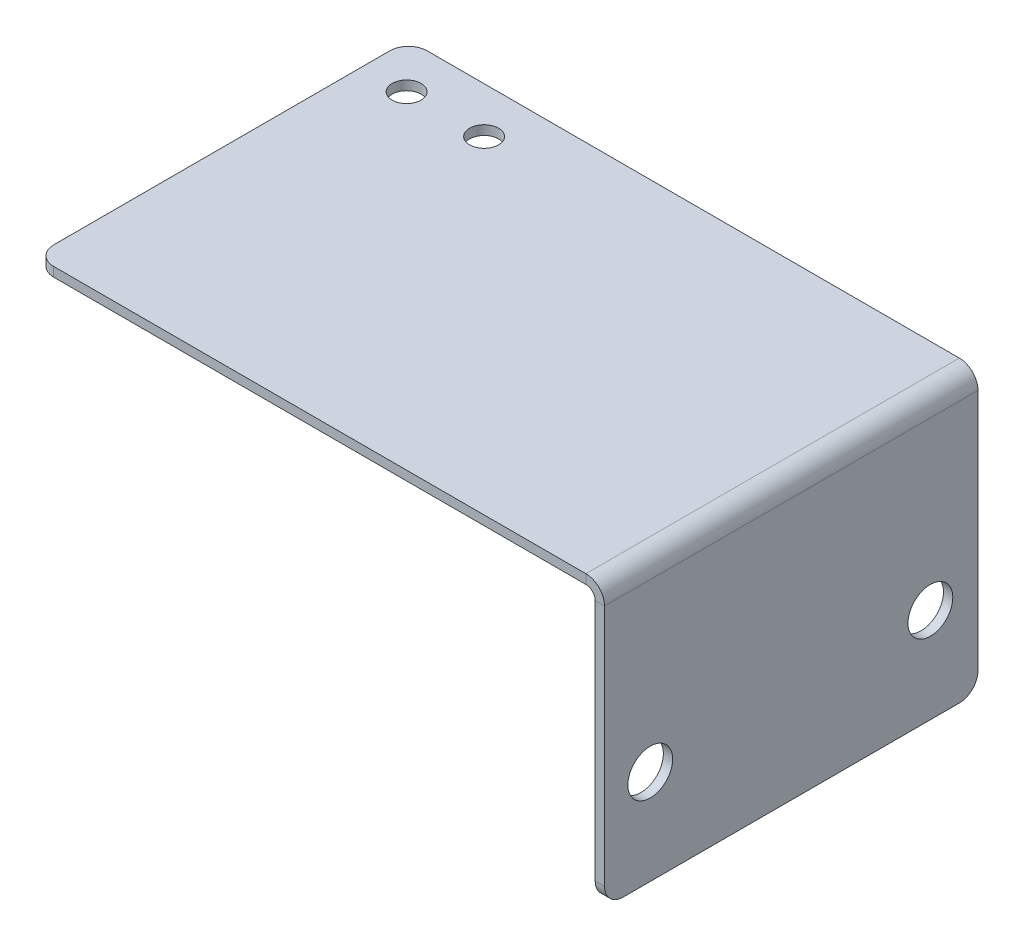
ISO-10303-21;
HEADER;
FILE_DESCRIPTION(('STEP AP214'),'2;1');
FILE_NAME('part.step','',(''),(''),'','','');
FILE_SCHEMA(('AUTOMOTIVE_DESIGN { 1 0 10303 214 1 1 1 1 }'));
ENDSEC;
DATA;
#1=APPLICATION_CONTEXT('core data for automotive mechanical design processes');
#2=APPLICATION_PROTOCOL_DEFINITION('international standard','automotive_design',2000,#1);
#3=PRODUCT_CONTEXT('',#1,'mechanical');
#4=PRODUCT('Part','Part','',(#3));
#5=PRODUCT_RELATED_PRODUCT_CATEGORY('part','',(#4));
#6=PRODUCT_DEFINITION_FORMATION('','',#4);
#7=PRODUCT_DEFINITION_CONTEXT('part definition',#1,'design');
#8=PRODUCT_DEFINITION('design','',#6,#7);
#9=PRODUCT_DEFINITION_SHAPE('','',#8);
#10=(LENGTH_UNIT() NAMED_UNIT(*) SI_UNIT(.MILLI.,.METRE.));
#11=(NAMED_UNIT(*) PLANE_ANGLE_UNIT() SI_UNIT($,.RADIAN.));
#12=(NAMED_UNIT(*) SI_UNIT($,.STERADIAN.) SOLID_ANGLE_UNIT());
#13=UNCERTAINTY_MEASURE_WITH_UNIT(LENGTH_MEASURE(1.E-05),#10,'distance_accuracy_value','');
#14=(GEOMETRIC_REPRESENTATION_CONTEXT(3) GLOBAL_UNCERTAINTY_ASSIGNED_CONTEXT((#13)) GLOBAL_UNIT_ASSIGNED_CONTEXT((#10,
#11,#12)) REPRESENTATION_CONTEXT('',''));
#15=CARTESIAN_POINT('',(0.,0.,0.));
#16=DIRECTION('',(0.,0.,1.));
#17=DIRECTION('',(1.,0.,0.));
#18=AXIS2_PLACEMENT_3D('',#15,#16,#17);
#19=CARTESIAN_POINT('',(0.,-2.,40.));
#20=DIRECTION('',(0.,0.,1.));
#21=DIRECTION('',(1.,0.,0.));
#22=AXIS2_PLACEMENT_3D('',#19,#20,#21);
#23=PLANE('',#22);
#24=DIRECTION('',(-1.,0.,0.));
#25=VECTOR('',#24,1.);
#26=CARTESIAN_POINT('',(0.,-2.,40.));
#27=LINE('',#26,#25);
#28=CARTESIAN_POINT('',(0.,-2.,40.));
#29=VERTEX_POINT('',#28);
#30=CARTESIAN_POINT('',(-1.,-2.,40.));
#31=VERTEX_POINT('',#30);
#32=EDGE_CURVE('E136',#29,#31,#27,.T.);
#33=ORIENTED_EDGE('',*,*,#32,.F.);
#34=CARTESIAN_POINT('',(-2.00000000000001,-2.,40.));
#35=DIRECTION('',(0.,0.,1.));
#36=DIRECTION('',(1.,0.,0.));
#37=AXIS2_PLACEMENT_3D('',#34,#35,#36);
#38=CIRCLE('',#37,2.);
#39=CARTESIAN_POINT('',(-2.00000000000004,0.,40.));
#40=VERTEX_POINT('',#39);
#41=EDGE_CURVE('E140',#40,#29,#38,.F.);
#42=ORIENTED_EDGE('',*,*,#41,.F.);
#43=DIRECTION('',(0.,1.,0.));
#44=VECTOR('',#43,1.);
#45=CARTESIAN_POINT('',(-2.00000000000002,-1.,40.));
#46=LINE('',#45,#44);
#47=CARTESIAN_POINT('',(-2.00000000000002,-1.,40.));
#48=VERTEX_POINT('',#47);
#49=EDGE_CURVE('E149',#48,#40,#46,.T.);
#50=ORIENTED_EDGE('',*,*,#49,.F.);
#51=CARTESIAN_POINT('',(-2.00000000000001,-2.,40.));
#52=DIRECTION('',(0.,0.,1.));
#53=DIRECTION('',(1.,0.,0.));
#54=AXIS2_PLACEMENT_3D('',#51,#52,#53);
#55=CIRCLE('',#54,1.);
#56=EDGE_CURVE('E142',#48,#31,#55,.F.);
#57=ORIENTED_EDGE('',*,*,#56,.T.);
#58=EDGE_LOOP('',(#33,#42,#50,#57));
#59=FACE_BOUND('',#58,.T.);
#60=ADVANCED_FACE('F44',(#59),#23,.T.);
#61=CARTESIAN_POINT('',(-2.00000000000002,-1.,40.));
#62=DIRECTION('',(0.,0.,1.));
#63=DIRECTION('',(1.,0.,0.));
#64=AXIS2_PLACEMENT_3D('',#61,#62,#63);
#65=PLANE('',#64);
#66=DIRECTION('',(0.,-1.,0.));
#67=VECTOR('',#66,1.);
#68=CARTESIAN_POINT('',(-1.,0.,40.));
#69=LINE('',#68,#67);
#70=CARTESIAN_POINT('',(-0.999999999999997,-28.,40.));
#71=VERTEX_POINT('',#70);
#72=EDGE_CURVE('E172',#31,#71,#69,.T.);
#73=ORIENTED_EDGE('',*,*,#72,.T.);
#74=DIRECTION('',(-1.,0.,0.));
#75=VECTOR('',#74,1.);
#76=CARTESIAN_POINT('',(-2.00000000000002,-28.,40.));
#77=LINE('',#76,#75);
#78=CARTESIAN_POINT('',(0.,-28.,40.));
#79=VERTEX_POINT('',#78);
#80=EDGE_CURVE('E170',#71,#79,#77,.F.);
#81=ORIENTED_EDGE('',*,*,#80,.T.);
#82=DIRECTION('',(0.,-1.,0.));
#83=VECTOR('',#82,1.);
#84=CARTESIAN_POINT('',(0.,0.,40.));
#85=LINE('',#84,#83);
#86=EDGE_CURVE('E157',#29,#79,#85,.T.);
#87=ORIENTED_EDGE('',*,*,#86,.F.);
#88=ORIENTED_EDGE('',*,*,#32,.T.);
#89=EDGE_LOOP('',(#73,#81,#87,#88));
#90=FACE_BOUND('',#89,.T.);
#91=ADVANCED_FACE('F168',(#90),#65,.T.);
#92=CARTESIAN_POINT('',(-2.00000000000004,0.,0.));
#93=DIRECTION('',(0.,0.,-1.));
#94=DIRECTION('',(-1.,0.,0.));
#95=AXIS2_PLACEMENT_3D('',#92,#93,#94);
#96=PLANE('',#95);
#97=DIRECTION('',(0.,-1.,0.));
#98=VECTOR('',#97,1.);
#99=CARTESIAN_POINT('',(-2.00000000000004,0.,0.));
#100=LINE('',#99,#98);
#101=CARTESIAN_POINT('',(-2.00000000000004,0.,0.));
#102=VERTEX_POINT('',#101);
#103=CARTESIAN_POINT('',(-2.00000000000002,-1.,0.));
#104=VERTEX_POINT('',#103);
#105=EDGE_CURVE('E236',#102,#104,#100,.T.);
#106=ORIENTED_EDGE('',*,*,#105,.F.);
#107=CARTESIAN_POINT('',(-2.00000000000001,-2.,0.));
#108=DIRECTION('',(0.,0.,1.));
#109=DIRECTION('',(1.,0.,0.));
#110=AXIS2_PLACEMENT_3D('',#107,#108,#109);
#111=CIRCLE('',#110,2.);
#112=CARTESIAN_POINT('',(0.,-2.,0.));
#113=VERTEX_POINT('',#112);
#114=EDGE_CURVE('E198',#102,#113,#111,.F.);
#115=ORIENTED_EDGE('',*,*,#114,.T.);
#116=DIRECTION('',(1.,0.,0.));
#117=VECTOR('',#116,1.);
#118=CARTESIAN_POINT('',(-1.,-2.,0.));
#119=LINE('',#118,#117);
#120=CARTESIAN_POINT('',(-1.,-2.,0.));
#121=VERTEX_POINT('',#120);
#122=EDGE_CURVE('E233',#121,#113,#119,.T.);
#123=ORIENTED_EDGE('',*,*,#122,.F.);
#124=CARTESIAN_POINT('',(-2.00000000000001,-2.,0.));
#125=DIRECTION('',(0.,0.,1.));
#126=DIRECTION('',(1.,0.,0.));
#127=AXIS2_PLACEMENT_3D('',#124,#125,#126);
#128=CIRCLE('',#127,1.);
#129=EDGE_CURVE('E207',#104,#121,#128,.F.);
#130=ORIENTED_EDGE('',*,*,#129,.F.);
#131=EDGE_LOOP('',(#106,#115,#123,#130));
#132=FACE_BOUND('',#131,.T.);
#133=ADVANCED_FACE('F370',(#132),#96,.T.);
#134=CARTESIAN_POINT('',(-1.,-2.,0.));
#135=DIRECTION('',(0.,0.,-1.));
#136=DIRECTION('',(-1.,0.,0.));
#137=AXIS2_PLACEMENT_3D('',#134,#135,#136);
#138=PLANE('',#137);
#139=DIRECTION('',(1.,0.,0.));
#140=VECTOR('',#139,1.);
#141=CARTESIAN_POINT('',(-61.,-1.,0.));
#142=LINE('',#141,#140);
#143=CARTESIAN_POINT('',(-59.,-1.,0.));
#144=VERTEX_POINT('',#143);
#145=EDGE_CURVE('E204',#144,#104,#142,.T.);
#146=ORIENTED_EDGE('',*,*,#145,.F.);
#147=DIRECTION('',(0.,1.,0.));
#148=VECTOR('',#147,1.);
#149=CARTESIAN_POINT('',(-59.,-2.,0.));
#150=LINE('',#149,#148);
#151=CARTESIAN_POINT('',(-59.,0.,0.));
#152=VERTEX_POINT('',#151);
#153=EDGE_CURVE('E267',#144,#152,#150,.T.);
#154=ORIENTED_EDGE('',*,*,#153,.T.);
#155=DIRECTION('',(1.,0.,0.));
#156=VECTOR('',#155,1.);
#157=CARTESIAN_POINT('',(-61.,0.,0.));
#158=LINE('',#157,#156);
#159=EDGE_CURVE('E201',#152,#102,#158,.T.);
#160=ORIENTED_EDGE('',*,*,#159,.T.);
#161=ORIENTED_EDGE('',*,*,#105,.T.);
#162=EDGE_LOOP('',(#146,#154,#160,#161));
#163=FACE_BOUND('',#162,.T.);
#164=ADVANCED_FACE('F296',(#163),#138,.T.);
#165=CARTESIAN_POINT('',(-1.,0.,40.));
#166=DIRECTION('',(1.,0.,0.));
#167=DIRECTION('',(0.,1.,0.));
#168=AXIS2_PLACEMENT_3D('',#165,#166,#167);
#169=PLANE('',#168);
#170=CARTESIAN_POINT('',(-0.999999999999998,-19.8499942550473,35.1000000000001));
#171=DIRECTION('',(1.,0.,0.));
#172=DIRECTION('',(0.,1.,0.));
#173=AXIS2_PLACEMENT_3D('',#170,#171,#172);
#174=CIRCLE('',#173,2.39999999999999);
#175=CARTESIAN_POINT('',(-0.999999999999998,-17.4499942550474,35.1000000000001));
#176=VERTEX_POINT('',#175);
#177=EDGE_CURVE('E48',#176,#176,#174,.T.);
#178=ORIENTED_EDGE('',*,*,#177,.T.);
#179=EDGE_LOOP('',(#178));
#180=FACE_BOUND('',#179,.T.);
#181=CARTESIAN_POINT('',(-0.999999999999998,-19.8499942550473,5.10000000000005));
#182=DIRECTION('',(1.,0.,0.));
#183=DIRECTION('',(0.,1.,0.));
#184=AXIS2_PLACEMENT_3D('',#181,#182,#183);
#185=CIRCLE('',#184,2.39999999999999);
#186=CARTESIAN_POINT('',(-0.999999999999998,-17.4499942550473,5.10000000000005));
#187=VERTEX_POINT('',#186);
#188=EDGE_CURVE('E324',#187,#187,#185,.T.);
#189=ORIENTED_EDGE('',*,*,#188,.T.);
#190=EDGE_LOOP('',(#189));
#191=FACE_BOUND('',#190,.T.);
#192=DIRECTION('',(0.,0.,-1.));
#193=VECTOR('',#192,1.);
#194=CARTESIAN_POINT('',(-0.999999999999996,-30.,40.));
#195=LINE('',#194,#193);
#196=CARTESIAN_POINT('',(-0.999999999999996,-30.,38.));
#197=VERTEX_POINT('',#196);
#198=CARTESIAN_POINT('',(-0.999999999999996,-30.,2.));
#199=VERTEX_POINT('',#198);
#200=EDGE_CURVE('E229',#197,#199,#195,.T.);
#201=ORIENTED_EDGE('',*,*,#200,.F.);
#202=CARTESIAN_POINT('',(-0.999999999999997,-28.,38.));
#203=DIRECTION('',(1.,0.,0.));
#204=DIRECTION('',(0.,1.,0.));
#205=AXIS2_PLACEMENT_3D('',#202,#203,#204);
#206=CIRCLE('',#205,2.);
#207=EDGE_CURVE('E252',#197,#71,#206,.F.);
#208=ORIENTED_EDGE('',*,*,#207,.T.);
#209=ORIENTED_EDGE('',*,*,#72,.F.);
#210=DIRECTION('',(0.,0.,-1.));
#211=VECTOR('',#210,1.);
#212=CARTESIAN_POINT('',(-1.,-2.,40.));
#213=LINE('',#212,#211);
#214=EDGE_CURVE('E190',#31,#121,#213,.T.);
#215=ORIENTED_EDGE('',*,*,#214,.T.);
#216=DIRECTION('',(0.,-1.,0.));
#217=VECTOR('',#216,1.);
#218=CARTESIAN_POINT('',(-1.,0.,0.));
#219=LINE('',#218,#217);
#220=CARTESIAN_POINT('',(-0.999999999999997,-28.,0.));
#221=VERTEX_POINT('',#220);
#222=EDGE_CURVE('E191',#121,#221,#219,.T.);
#223=ORIENTED_EDGE('',*,*,#222,.T.);
#224=CARTESIAN_POINT('',(-0.999999999999997,-28.,2.));
#225=DIRECTION('',(1.,0.,0.));
#226=DIRECTION('',(0.,1.,0.));
#227=AXIS2_PLACEMENT_3D('',#224,#225,#226);
#228=CIRCLE('',#227,2.);
#229=EDGE_CURVE('E249',#221,#199,#228,.F.);
#230=ORIENTED_EDGE('',*,*,#229,.T.);
#231=EDGE_LOOP('',(#201,#208,#209,#215,#223,#230));
#232=FACE_BOUND('',#231,.T.);
#233=ADVANCED_FACE('F315',(#180,#191,#232),#169,.F.);
#234=CARTESIAN_POINT('',(0.,-30.,40.));
#235=DIRECTION('',(0.,-1.,0.));
#236=DIRECTION('',(0.,0.,-1.));
#237=AXIS2_PLACEMENT_3D('',#234,#235,#236);
#238=PLANE('',#237);
#239=DIRECTION('',(0.,0.,-1.));
#240=VECTOR('',#239,1.);
#241=CARTESIAN_POINT('',(0.,-30.,40.));
#242=LINE('',#241,#240);
#243=CARTESIAN_POINT('',(0.,-30.,38.));
#244=VERTEX_POINT('',#243);
#245=CARTESIAN_POINT('',(0.,-30.,2.));
#246=VERTEX_POINT('',#245);
#247=EDGE_CURVE('E165',#244,#246,#242,.T.);
#248=ORIENTED_EDGE('',*,*,#247,.F.);
#249=DIRECTION('',(-1.,0.,0.));
#250=VECTOR('',#249,1.);
#251=CARTESIAN_POINT('',(0.,-30.,38.));
#252=LINE('',#251,#250);
#253=EDGE_CURVE('E245',#244,#197,#252,.T.);
#254=ORIENTED_EDGE('',*,*,#253,.T.);
#255=ORIENTED_EDGE('',*,*,#200,.T.);
#256=DIRECTION('',(-1.,0.,0.));
#257=VECTOR('',#256,1.);
#258=CARTESIAN_POINT('',(0.,-30.,2.));
#259=LINE('',#258,#257);
#260=EDGE_CURVE('E148',#199,#246,#259,.F.);
#261=ORIENTED_EDGE('',*,*,#260,.T.);
#262=EDGE_LOOP('',(#248,#254,#255,#261));
#263=FACE_BOUND('',#262,.T.);
#264=ADVANCED_FACE('F419',(#263),#238,.T.);
#265=CARTESIAN_POINT('',(0.,0.,40.));
#266=DIRECTION('',(1.,0.,0.));
#267=DIRECTION('',(0.,1.,0.));
#268=AXIS2_PLACEMENT_3D('',#265,#266,#267);
#269=PLANE('',#268);
#270=CARTESIAN_POINT('',(0.,-19.8499942550473,35.1000000000001));
#271=DIRECTION('',(1.,0.,0.));
#272=DIRECTION('',(0.,0.,-1.));
#273=AXIS2_PLACEMENT_3D('',#270,#271,#272);
#274=CIRCLE('',#273,2.39999999999999);
#275=CARTESIAN_POINT('',(0.,-19.8499942550473,32.7000000000001));
#276=VERTEX_POINT('',#275);
#277=EDGE_CURVE('E342',#276,#276,#274,.T.);
#278=ORIENTED_EDGE('',*,*,#277,.F.);
#279=EDGE_LOOP('',(#278));
#280=FACE_BOUND('',#279,.T.);
#281=CARTESIAN_POINT('',(0.,-19.8499942550473,5.10000000000005));
#282=DIRECTION('',(1.,0.,0.));
#283=DIRECTION('',(0.,0.,-1.));
#284=AXIS2_PLACEMENT_3D('',#281,#282,#283);
#285=CIRCLE('',#284,2.39999999999999);
#286=CARTESIAN_POINT('',(0.,-19.8499942550473,2.70000000000006));
#287=VERTEX_POINT('',#286);
#288=EDGE_CURVE('E338',#287,#287,#285,.T.);
#289=ORIENTED_EDGE('',*,*,#288,.F.);
#290=EDGE_LOOP('',(#289));
#291=FACE_BOUND('',#290,.T.);
#292=ORIENTED_EDGE('',*,*,#86,.T.);
#293=CARTESIAN_POINT('',(0.,-28.,38.));
#294=DIRECTION('',(1.,0.,0.));
#295=DIRECTION('',(0.,1.,0.));
#296=AXIS2_PLACEMENT_3D('',#293,#294,#295);
#297=CIRCLE('',#296,2.);
#298=EDGE_CURVE('E260',#79,#244,#297,.T.);
#299=ORIENTED_EDGE('',*,*,#298,.T.);
#300=ORIENTED_EDGE('',*,*,#247,.T.);
#301=CARTESIAN_POINT('',(0.,-28.,2.));
#302=DIRECTION('',(1.,0.,0.));
#303=DIRECTION('',(0.,1.,0.));
#304=AXIS2_PLACEMENT_3D('',#301,#302,#303);
#305=CIRCLE('',#304,2.);
#306=CARTESIAN_POINT('',(0.,-28.,0.));
#307=VERTEX_POINT('',#306);
#308=EDGE_CURVE('E257',#246,#307,#305,.T.);
#309=ORIENTED_EDGE('',*,*,#308,.T.);
#310=DIRECTION('',(0.,-1.,0.));
#311=VECTOR('',#310,1.);
#312=CARTESIAN_POINT('',(0.,0.,0.));
#313=LINE('',#312,#311);
#314=EDGE_CURVE('E160',#113,#307,#313,.T.);
#315=ORIENTED_EDGE('',*,*,#314,.F.);
#316=DIRECTION('',(0.,0.,-1.));
#317=VECTOR('',#316,1.);
#318=CARTESIAN_POINT('',(0.,-2.,40.));
#319=LINE('',#318,#317);
#320=EDGE_CURVE('E155',#29,#113,#319,.T.);
#321=ORIENTED_EDGE('',*,*,#320,.F.);
#322=EDGE_LOOP('',(#292,#299,#300,#309,#315,#321));
#323=FACE_BOUND('',#322,.T.);
#324=ADVANCED_FACE('F156',(#280,#291,#323),#269,.T.);
#325=CARTESIAN_POINT('',(-2.00000000000001,-2.,40.));
#326=DIRECTION('',(0.,0.,-1.));
#327=DIRECTION('',(-1.,0.,0.));
#328=AXIS2_PLACEMENT_3D('',#325,#326,#327);
#329=CYLINDRICAL_SURFACE('',#328,2.);
#330=ORIENTED_EDGE('',*,*,#114,.F.);
#331=DIRECTION('',(0.,0.,-1.));
#332=VECTOR('',#331,1.);
#333=CARTESIAN_POINT('',(-2.00000000000004,0.,40.));
#334=LINE('',#333,#332);
#335=EDGE_CURVE('E166',#40,#102,#334,.T.);
#336=ORIENTED_EDGE('',*,*,#335,.F.);
#337=ORIENTED_EDGE('',*,*,#41,.T.);
#338=ORIENTED_EDGE('',*,*,#320,.T.);
#339=EDGE_LOOP('',(#330,#336,#337,#338));
#340=FACE_BOUND('',#339,.T.);
#341=ADVANCED_FACE('F175',(#340),#329,.T.);
#342=CARTESIAN_POINT('',(-61.,0.,40.));
#343=DIRECTION('',(0.,1.,0.));
#344=DIRECTION('',(0.,0.,1.));
#345=AXIS2_PLACEMENT_3D('',#342,#343,#344);
#346=PLANE('',#345);
#347=CARTESIAN_POINT('',(-56.3000000000001,0.,4.90000000000001));
#348=DIRECTION('',(0.,1.,0.));
#349=DIRECTION('',(0.,0.,1.));
#350=AXIS2_PLACEMENT_3D('',#347,#348,#349);
#351=CIRCLE('',#350,1.55);
#352=CARTESIAN_POINT('',(-56.3000000000001,0.,6.45000000000001));
#353=VERTEX_POINT('',#352);
#354=EDGE_CURVE('E328',#353,#353,#351,.T.);
#355=ORIENTED_EDGE('',*,*,#354,.F.);
#356=EDGE_LOOP('',(#355));
#357=FACE_BOUND('',#356,.T.);
#358=CARTESIAN_POINT('',(-48.0000000000001,0.,4.90000000000001));
#359=DIRECTION('',(0.,1.,0.));
#360=DIRECTION('',(0.,0.,1.));
#361=AXIS2_PLACEMENT_3D('',#358,#359,#360);
#362=CIRCLE('',#361,1.55);
#363=CARTESIAN_POINT('',(-48.0000000000001,0.,6.45000000000001));
#364=VERTEX_POINT('',#363);
#365=EDGE_CURVE('E319',#364,#364,#362,.T.);
#366=ORIENTED_EDGE('',*,*,#365,.F.);
#367=EDGE_LOOP('',(#366));
#368=FACE_BOUND('',#367,.T.);
#369=ORIENTED_EDGE('',*,*,#159,.F.);
#370=CARTESIAN_POINT('',(-59.,0.,2.));
#371=DIRECTION('',(0.,1.,0.));
#372=DIRECTION('',(0.,0.,1.));
#373=AXIS2_PLACEMENT_3D('',#370,#371,#372);
#374=CIRCLE('',#373,2.);
#375=CARTESIAN_POINT('',(-61.,0.,2.));
#376=VERTEX_POINT('',#375);
#377=EDGE_CURVE('E274',#152,#376,#374,.T.);
#378=ORIENTED_EDGE('',*,*,#377,.T.);
#379=DIRECTION('',(0.,0.,-1.));
#380=VECTOR('',#379,1.);
#381=CARTESIAN_POINT('',(-61.,0.,40.));
#382=LINE('',#381,#380);
#383=CARTESIAN_POINT('',(-61.,0.,38.));
#384=VERTEX_POINT('',#383);
#385=EDGE_CURVE('E221',#384,#376,#382,.T.);
#386=ORIENTED_EDGE('',*,*,#385,.F.);
#387=CARTESIAN_POINT('',(-59.,0.,38.));
#388=DIRECTION('',(0.,1.,0.));
#389=DIRECTION('',(0.,0.,1.));
#390=AXIS2_PLACEMENT_3D('',#387,#388,#389);
#391=CIRCLE('',#390,2.);
#392=CARTESIAN_POINT('',(-59.,0.,40.));
#393=VERTEX_POINT('',#392);
#394=EDGE_CURVE('E271',#384,#393,#391,.T.);
#395=ORIENTED_EDGE('',*,*,#394,.T.);
#396=DIRECTION('',(1.,0.,0.));
#397=VECTOR('',#396,1.);
#398=CARTESIAN_POINT('',(-61.,0.,40.));
#399=LINE('',#398,#397);
#400=EDGE_CURVE('E178',#393,#40,#399,.T.);
#401=ORIENTED_EDGE('',*,*,#400,.T.);
#402=ORIENTED_EDGE('',*,*,#335,.T.);
#403=EDGE_LOOP('',(#369,#378,#386,#395,#401,#402));
#404=FACE_BOUND('',#403,.T.);
#405=ADVANCED_FACE('F302',(#357,#368,#404),#346,.T.);
#406=CARTESIAN_POINT('',(-61.,-1.,40.));
#407=DIRECTION('',(-1.,0.,0.));
#408=DIRECTION('',(0.,0.,1.));
#409=AXIS2_PLACEMENT_3D('',#406,#407,#408);
#410=PLANE('',#409);
#411=ORIENTED_EDGE('',*,*,#385,.T.);
#412=DIRECTION('',(0.,1.,0.));
#413=VECTOR('',#412,1.);
#414=CARTESIAN_POINT('',(-61.,-1.,2.));
#415=LINE('',#414,#413);
#416=CARTESIAN_POINT('',(-61.,-1.,2.));
#417=VERTEX_POINT('',#416);
#418=EDGE_CURVE('E67',#376,#417,#415,.F.);
#419=ORIENTED_EDGE('',*,*,#418,.T.);
#420=DIRECTION('',(0.,0.,-1.));
#421=VECTOR('',#420,1.);
#422=CARTESIAN_POINT('',(-61.,-1.,40.));
#423=LINE('',#422,#421);
#424=CARTESIAN_POINT('',(-61.,-1.,38.));
#425=VERTEX_POINT('',#424);
#426=EDGE_CURVE('E218',#425,#417,#423,.T.);
#427=ORIENTED_EDGE('',*,*,#426,.F.);
#428=DIRECTION('',(0.,1.,0.));
#429=VECTOR('',#428,1.);
#430=CARTESIAN_POINT('',(-61.,-1.,38.));
#431=LINE('',#430,#429);
#432=EDGE_CURVE('E277',#425,#384,#431,.T.);
#433=ORIENTED_EDGE('',*,*,#432,.T.);
#434=EDGE_LOOP('',(#411,#419,#427,#433));
#435=FACE_BOUND('',#434,.T.);
#436=ADVANCED_FACE('F303',(#435),#410,.T.);
#437=CARTESIAN_POINT('',(-61.,-1.,40.));
#438=DIRECTION('',(0.,1.,0.));
#439=DIRECTION('',(0.,0.,1.));
#440=AXIS2_PLACEMENT_3D('',#437,#438,#439);
#441=PLANE('',#440);
#442=CARTESIAN_POINT('',(-56.3000000000001,-1.,4.90000000000001));
#443=DIRECTION('',(0.,1.,0.));
#444=DIRECTION('',(0.,0.,1.));
#445=AXIS2_PLACEMENT_3D('',#442,#443,#444);
#446=CIRCLE('',#445,1.55);
#447=CARTESIAN_POINT('',(-56.3000000000001,-1.,6.45000000000001));
#448=VERTEX_POINT('',#447);
#449=EDGE_CURVE('E195',#448,#448,#446,.T.);
#450=ORIENTED_EDGE('',*,*,#449,.T.);
#451=EDGE_LOOP('',(#450));
#452=FACE_BOUND('',#451,.T.);
#453=CARTESIAN_POINT('',(-48.0000000000001,-1.,4.90000000000001));
#454=DIRECTION('',(0.,1.,0.));
#455=DIRECTION('',(0.,0.,1.));
#456=AXIS2_PLACEMENT_3D('',#453,#454,#455);
#457=CIRCLE('',#456,1.55);
#458=CARTESIAN_POINT('',(-48.0000000000001,-1.,6.45000000000001));
#459=VERTEX_POINT('',#458);
#460=EDGE_CURVE('E323',#459,#459,#457,.T.);
#461=ORIENTED_EDGE('',*,*,#460,.T.);
#462=EDGE_LOOP('',(#461));
#463=FACE_BOUND('',#462,.T.);
#464=ORIENTED_EDGE('',*,*,#426,.T.);
#465=CARTESIAN_POINT('',(-59.,-1.,2.));
#466=DIRECTION('',(0.,1.,0.));
#467=DIRECTION('',(0.,0.,1.));
#468=AXIS2_PLACEMENT_3D('',#465,#466,#467);
#469=CIRCLE('',#468,2.);
#470=EDGE_CURVE('E54',#417,#144,#469,.F.);
#471=ORIENTED_EDGE('',*,*,#470,.T.);
#472=ORIENTED_EDGE('',*,*,#145,.T.);
#473=DIRECTION('',(0.,0.,-1.));
#474=VECTOR('',#473,1.);
#475=CARTESIAN_POINT('',(-2.00000000000002,-1.,40.));
#476=LINE('',#475,#474);
#477=EDGE_CURVE('E214',#48,#104,#476,.T.);
#478=ORIENTED_EDGE('',*,*,#477,.F.);
#479=DIRECTION('',(1.,0.,0.));
#480=VECTOR('',#479,1.);
#481=CARTESIAN_POINT('',(-61.,-1.,40.));
#482=LINE('',#481,#480);
#483=CARTESIAN_POINT('',(-59.,-1.,40.));
#484=VERTEX_POINT('',#483);
#485=EDGE_CURVE('E182',#484,#48,#482,.T.);
#486=ORIENTED_EDGE('',*,*,#485,.F.);
#487=CARTESIAN_POINT('',(-59.,-1.,38.));
#488=DIRECTION('',(0.,1.,0.));
#489=DIRECTION('',(0.,0.,1.));
#490=AXIS2_PLACEMENT_3D('',#487,#488,#489);
#491=CIRCLE('',#490,2.);
#492=EDGE_CURVE('E283',#484,#425,#491,.F.);
#493=ORIENTED_EDGE('',*,*,#492,.T.);
#494=EDGE_LOOP('',(#464,#471,#472,#478,#486,#493));
#495=FACE_BOUND('',#494,.T.);
#496=ADVANCED_FACE('F291',(#452,#463,#495),#441,.F.);
#497=CARTESIAN_POINT('',(-2.00000000000001,-2.,40.));
#498=DIRECTION('',(0.,0.,-1.));
#499=DIRECTION('',(-1.,0.,0.));
#500=AXIS2_PLACEMENT_3D('',#497,#498,#499);
#501=CYLINDRICAL_SURFACE('',#500,1.);
#502=ORIENTED_EDGE('',*,*,#129,.T.);
#503=ORIENTED_EDGE('',*,*,#214,.F.);
#504=ORIENTED_EDGE('',*,*,#56,.F.);
#505=ORIENTED_EDGE('',*,*,#477,.T.);
#506=EDGE_LOOP('',(#502,#503,#504,#505));
#507=FACE_BOUND('',#506,.T.);
#508=ADVANCED_FACE('F310',(#507),#501,.F.);
#509=CARTESIAN_POINT('',(-2.00000000000001,-2.,40.));
#510=DIRECTION('',(0.,0.,1.));
#511=DIRECTION('',(1.,0.,0.));
#512=AXIS2_PLACEMENT_3D('',#509,#510,#511);
#513=PLANE('',#512);
#514=ORIENTED_EDGE('',*,*,#400,.F.);
#515=DIRECTION('',(0.,1.,0.));
#516=VECTOR('',#515,1.);
#517=CARTESIAN_POINT('',(-59.,-2.,40.));
#518=LINE('',#517,#516);
#519=EDGE_CURVE('E11',#393,#484,#518,.F.);
#520=ORIENTED_EDGE('',*,*,#519,.T.);
#521=ORIENTED_EDGE('',*,*,#485,.T.);
#522=ORIENTED_EDGE('',*,*,#49,.T.);
#523=EDGE_LOOP('',(#514,#520,#521,#522));
#524=FACE_BOUND('',#523,.T.);
#525=ADVANCED_FACE('F307',(#524),#513,.T.);
#526=CARTESIAN_POINT('',(-2.00000000000001,-2.,0.));
#527=DIRECTION('',(0.,0.,1.));
#528=DIRECTION('',(1.,0.,0.));
#529=AXIS2_PLACEMENT_3D('',#526,#527,#528);
#530=PLANE('',#529);
#531=ORIENTED_EDGE('',*,*,#314,.T.);
#532=DIRECTION('',(-1.,0.,0.));
#533=VECTOR('',#532,1.);
#534=CARTESIAN_POINT('',(-0.999999999999996,-28.,0.));
#535=LINE('',#534,#533);
#536=EDGE_CURVE('E263',#307,#221,#535,.T.);
#537=ORIENTED_EDGE('',*,*,#536,.T.);
#538=ORIENTED_EDGE('',*,*,#222,.F.);
#539=ORIENTED_EDGE('',*,*,#122,.T.);
#540=EDGE_LOOP('',(#531,#537,#538,#539));
#541=FACE_BOUND('',#540,.T.);
#542=ADVANCED_FACE('F378',(#541),#530,.F.);
#543=CARTESIAN_POINT('',(0.,-28.,38.));
#544=DIRECTION('',(-1.,0.,0.));
#545=DIRECTION('',(0.,0.,1.));
#546=AXIS2_PLACEMENT_3D('',#543,#544,#545);
#547=CYLINDRICAL_SURFACE('',#546,2.);
#548=ORIENTED_EDGE('',*,*,#298,.F.);
#549=ORIENTED_EDGE('',*,*,#80,.F.);
#550=ORIENTED_EDGE('',*,*,#207,.F.);
#551=ORIENTED_EDGE('',*,*,#253,.F.);
#552=EDGE_LOOP('',(#548,#549,#550,#551));
#553=FACE_BOUND('',#552,.T.);
#554=ADVANCED_FACE('F374',(#553),#547,.T.);
#555=CARTESIAN_POINT('',(-2.00000000000001,-28.,2.));
#556=DIRECTION('',(1.,0.,0.));
#557=DIRECTION('',(0.,0.,-1.));
#558=AXIS2_PLACEMENT_3D('',#555,#556,#557);
#559=CYLINDRICAL_SURFACE('',#558,2.);
#560=ORIENTED_EDGE('',*,*,#308,.F.);
#561=ORIENTED_EDGE('',*,*,#260,.F.);
#562=ORIENTED_EDGE('',*,*,#229,.F.);
#563=ORIENTED_EDGE('',*,*,#536,.F.);
#564=EDGE_LOOP('',(#560,#561,#562,#563));
#565=FACE_BOUND('',#564,.T.);
#566=ADVANCED_FACE('F377',(#565),#559,.T.);
#567=CARTESIAN_POINT('',(-59.,-2.,2.));
#568=DIRECTION('',(0.,1.,0.));
#569=DIRECTION('',(0.,0.,1.));
#570=AXIS2_PLACEMENT_3D('',#567,#568,#569);
#571=CYLINDRICAL_SURFACE('',#570,2.);
#572=ORIENTED_EDGE('',*,*,#470,.F.);
#573=ORIENTED_EDGE('',*,*,#418,.F.);
#574=ORIENTED_EDGE('',*,*,#377,.F.);
#575=ORIENTED_EDGE('',*,*,#153,.F.);
#576=EDGE_LOOP('',(#572,#573,#574,#575));
#577=FACE_BOUND('',#576,.T.);
#578=ADVANCED_FACE('F299',(#577),#571,.T.);
#579=CARTESIAN_POINT('',(-59.,-1.,38.));
#580=DIRECTION('',(0.,1.,0.));
#581=DIRECTION('',(0.,0.,1.));
#582=AXIS2_PLACEMENT_3D('',#579,#580,#581);
#583=CYLINDRICAL_SURFACE('',#582,2.);
#584=ORIENTED_EDGE('',*,*,#492,.F.);
#585=ORIENTED_EDGE('',*,*,#519,.F.);
#586=ORIENTED_EDGE('',*,*,#394,.F.);
#587=ORIENTED_EDGE('',*,*,#432,.F.);
#588=EDGE_LOOP('',(#584,#585,#586,#587));
#589=FACE_BOUND('',#588,.T.);
#590=ADVANCED_FACE('F46',(#589),#583,.T.);
#591=CARTESIAN_POINT('',(-48.0000000000001,-1.,4.90000000000001));
#592=DIRECTION('',(0.,1.,0.));
#593=DIRECTION('',(0.,0.,1.));
#594=AXIS2_PLACEMENT_3D('',#591,#592,#593);
#595=CYLINDRICAL_SURFACE('',#594,1.55);
#596=ORIENTED_EDGE('',*,*,#460,.F.);
#597=EDGE_LOOP('',(#596));
#598=FACE_BOUND('',#597,.T.);
#599=ORIENTED_EDGE('',*,*,#365,.T.);
#600=EDGE_LOOP('',(#599));
#601=FACE_BOUND('',#600,.T.);
#602=ADVANCED_FACE('F386',(#598,#601),#595,.F.);
#603=CARTESIAN_POINT('',(-56.3000000000001,-1.,4.90000000000001));
#604=DIRECTION('',(0.,1.,0.));
#605=DIRECTION('',(0.,0.,1.));
#606=AXIS2_PLACEMENT_3D('',#603,#604,#605);
#607=CYLINDRICAL_SURFACE('',#606,1.55);
#608=ORIENTED_EDGE('',*,*,#449,.F.);
#609=EDGE_LOOP('',(#608));
#610=FACE_BOUND('',#609,.T.);
#611=ORIENTED_EDGE('',*,*,#354,.T.);
#612=EDGE_LOOP('',(#611));
#613=FACE_BOUND('',#612,.T.);
#614=ADVANCED_FACE('F362',(#610,#613),#607,.F.);
#615=CARTESIAN_POINT('',(0.,-19.8499942550473,5.10000000000005));
#616=DIRECTION('',(1.,0.,0.));
#617=DIRECTION('',(0.,0.,-1.));
#618=AXIS2_PLACEMENT_3D('',#615,#616,#617);
#619=CYLINDRICAL_SURFACE('',#618,2.39999999999999);
#620=ORIENTED_EDGE('',*,*,#288,.T.);
#621=EDGE_LOOP('',(#620));
#622=FACE_BOUND('',#621,.T.);
#623=ORIENTED_EDGE('',*,*,#188,.F.);
#624=EDGE_LOOP('',(#623));
#625=FACE_BOUND('',#624,.T.);
#626=ADVANCED_FACE('F357',(#622,#625),#619,.F.);
#627=CARTESIAN_POINT('',(0.,-19.8499942550473,35.1000000000001));
#628=DIRECTION('',(1.,0.,0.));
#629=DIRECTION('',(0.,0.,-1.));
#630=AXIS2_PLACEMENT_3D('',#627,#628,#629);
#631=CYLINDRICAL_SURFACE('',#630,2.39999999999999);
#632=ORIENTED_EDGE('',*,*,#277,.T.);
#633=EDGE_LOOP('',(#632));
#634=FACE_BOUND('',#633,.T.);
#635=ORIENTED_EDGE('',*,*,#177,.F.);
#636=EDGE_LOOP('',(#635));
#637=FACE_BOUND('',#636,.T.);
#638=ADVANCED_FACE('F355',(#634,#637),#631,.F.);
#639=CLOSED_SHELL('',(#60,#91,#133,#164,#233,#264,#324,#341,#405,#436,#496,#508,#525,#542,#554,
#566,#578,#590,#602,#614,#626,#638));
#640=MANIFOLD_SOLID_BREP('B2',#639);
#641=ADVANCED_BREP_SHAPE_REPRESENTATION('',(#18,#640),#14);
#642=SHAPE_DEFINITION_REPRESENTATION(#9,#641);
ENDSEC;
END-ISO-10303-21;
